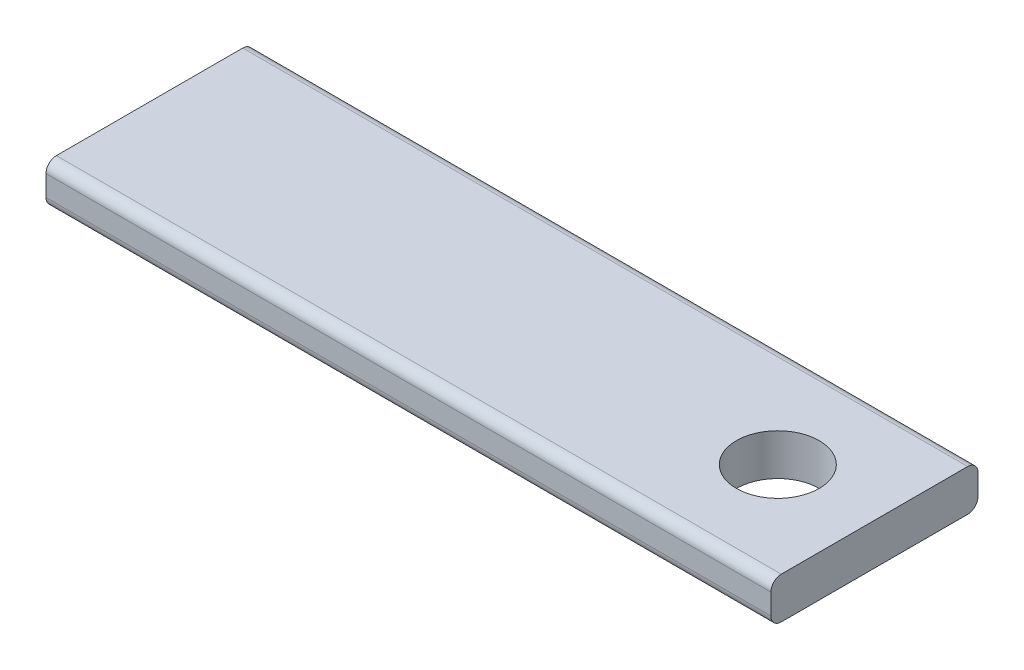
ISO-10303-21;
HEADER;
FILE_DESCRIPTION(('STEP AP214'),'2;1');
FILE_NAME('part.step','',(''),(''),'','','');
FILE_SCHEMA(('AUTOMOTIVE_DESIGN { 1 0 10303 214 1 1 1 1 }'));
ENDSEC;
DATA;
#1=APPLICATION_CONTEXT('core data for automotive mechanical design processes');
#2=APPLICATION_PROTOCOL_DEFINITION('international standard','automotive_design',2000,#1);
#3=PRODUCT_CONTEXT('',#1,'mechanical');
#4=PRODUCT('Part','Part','',(#3));
#5=PRODUCT_RELATED_PRODUCT_CATEGORY('part','',(#4));
#6=PRODUCT_DEFINITION_FORMATION('','',#4);
#7=PRODUCT_DEFINITION_CONTEXT('part definition',#1,'design');
#8=PRODUCT_DEFINITION('design','',#6,#7);
#9=PRODUCT_DEFINITION_SHAPE('','',#8);
#10=(LENGTH_UNIT() NAMED_UNIT(*) SI_UNIT(.MILLI.,.METRE.));
#11=(NAMED_UNIT(*) PLANE_ANGLE_UNIT() SI_UNIT($,.RADIAN.));
#12=(NAMED_UNIT(*) SI_UNIT($,.STERADIAN.) SOLID_ANGLE_UNIT());
#13=UNCERTAINTY_MEASURE_WITH_UNIT(LENGTH_MEASURE(1.E-05),#10,'distance_accuracy_value','');
#14=(GEOMETRIC_REPRESENTATION_CONTEXT(3) GLOBAL_UNCERTAINTY_ASSIGNED_CONTEXT((#13)) GLOBAL_UNIT_ASSIGNED_CONTEXT((#10,
#11,#12)) REPRESENTATION_CONTEXT('',''));
#15=CARTESIAN_POINT('',(0.,0.,0.));
#16=DIRECTION('',(0.,0.,1.));
#17=DIRECTION('',(1.,0.,0.));
#18=AXIS2_PLACEMENT_3D('',#15,#16,#17);
#19=CARTESIAN_POINT('',(26.25,1.5,7.5));
#20=DIRECTION('',(-1.,0.,0.));
#21=DIRECTION('',(0.,0.,1.));
#22=AXIS2_PLACEMENT_3D('',#19,#20,#21);
#23=PLANE('',#22);
#24=DIRECTION('',(0.,0.,-1.));
#25=VECTOR('',#24,1.);
#26=CARTESIAN_POINT('',(26.25,-1.5,7.5));
#27=LINE('',#26,#25);
#28=CARTESIAN_POINT('',(26.25,-1.5,6.75));
#29=VERTEX_POINT('',#28);
#30=CARTESIAN_POINT('',(26.25,-1.5,-6.75));
#31=VERTEX_POINT('',#30);
#32=EDGE_CURVE('E173',#29,#31,#27,.T.);
#33=ORIENTED_EDGE('',*,*,#32,.T.);
#34=CARTESIAN_POINT('',(26.25,-0.75,-6.75));
#35=DIRECTION('',(-1.,0.,0.));
#36=DIRECTION('',(0.,0.,1.));
#37=AXIS2_PLACEMENT_3D('',#34,#35,#36);
#38=CIRCLE('',#37,0.75);
#39=CARTESIAN_POINT('',(26.25,-0.75,-7.5));
#40=VERTEX_POINT('',#39);
#41=EDGE_CURVE('E147',#31,#40,#38,.F.);
#42=ORIENTED_EDGE('',*,*,#41,.T.);
#43=DIRECTION('',(0.,-1.,0.));
#44=VECTOR('',#43,1.);
#45=CARTESIAN_POINT('',(26.25,1.5,-7.5));
#46=LINE('',#45,#44);
#47=CARTESIAN_POINT('',(26.25,0.75,-7.5));
#48=VERTEX_POINT('',#47);
#49=EDGE_CURVE('E126',#48,#40,#46,.T.);
#50=ORIENTED_EDGE('',*,*,#49,.F.);
#51=CARTESIAN_POINT('',(26.25,0.75,-6.75));
#52=DIRECTION('',(-1.,0.,0.));
#53=DIRECTION('',(0.,0.,1.));
#54=AXIS2_PLACEMENT_3D('',#51,#52,#53);
#55=CIRCLE('',#54,0.75);
#56=CARTESIAN_POINT('',(26.25,1.5,-6.75));
#57=VERTEX_POINT('',#56);
#58=EDGE_CURVE('E131',#48,#57,#55,.F.);
#59=ORIENTED_EDGE('',*,*,#58,.T.);
#60=DIRECTION('',(0.,0.,-1.));
#61=VECTOR('',#60,1.);
#62=CARTESIAN_POINT('',(26.25,1.5,7.5));
#63=LINE('',#62,#61);
#64=CARTESIAN_POINT('',(26.25,1.5,6.75));
#65=VERTEX_POINT('',#64);
#66=EDGE_CURVE('E168',#65,#57,#63,.T.);
#67=ORIENTED_EDGE('',*,*,#66,.F.);
#68=CARTESIAN_POINT('',(26.25,0.75,6.75));
#69=DIRECTION('',(-1.,0.,0.));
#70=DIRECTION('',(0.,0.,1.));
#71=AXIS2_PLACEMENT_3D('',#68,#69,#70);
#72=CIRCLE('',#71,0.75);
#73=CARTESIAN_POINT('',(26.25,0.75,7.5));
#74=VERTEX_POINT('',#73);
#75=EDGE_CURVE('E61',#65,#74,#72,.F.);
#76=ORIENTED_EDGE('',*,*,#75,.T.);
#77=DIRECTION('',(0.,-1.,0.));
#78=VECTOR('',#77,1.);
#79=CARTESIAN_POINT('',(26.25,1.5,7.5));
#80=LINE('',#79,#78);
#81=CARTESIAN_POINT('',(26.25,-0.75,7.5));
#82=VERTEX_POINT('',#81);
#83=EDGE_CURVE('E158',#74,#82,#80,.T.);
#84=ORIENTED_EDGE('',*,*,#83,.T.);
#85=CARTESIAN_POINT('',(26.25,-0.75,6.75));
#86=DIRECTION('',(-1.,0.,0.));
#87=DIRECTION('',(0.,0.,1.));
#88=AXIS2_PLACEMENT_3D('',#85,#86,#87);
#89=CIRCLE('',#88,0.75);
#90=EDGE_CURVE('E54',#82,#29,#89,.F.);
#91=ORIENTED_EDGE('',*,*,#90,.T.);
#92=EDGE_LOOP('',(#33,#42,#50,#59,#67,#76,#84,#91));
#93=FACE_BOUND('',#92,.T.);
#94=ADVANCED_FACE('F39',(#93),#23,.F.);
#95=CARTESIAN_POINT('',(-26.25,1.5,-7.5));
#96=DIRECTION('',(0.,0.,1.));
#97=DIRECTION('',(1.,0.,0.));
#98=AXIS2_PLACEMENT_3D('',#95,#96,#97);
#99=PLANE('',#98);
#100=ORIENTED_EDGE('',*,*,#49,.T.);
#101=DIRECTION('',(-1.,0.,0.));
#102=VECTOR('',#101,1.);
#103=CARTESIAN_POINT('',(-26.25,-0.75,-7.5));
#104=LINE('',#103,#102);
#105=CARTESIAN_POINT('',(-26.25,-0.75,-7.5));
#106=VERTEX_POINT('',#105);
#107=EDGE_CURVE('E125',#40,#106,#104,.T.);
#108=ORIENTED_EDGE('',*,*,#107,.T.);
#109=DIRECTION('',(0.,-1.,0.));
#110=VECTOR('',#109,1.);
#111=CARTESIAN_POINT('',(-26.25,1.5,-7.5));
#112=LINE('',#111,#110);
#113=CARTESIAN_POINT('',(-26.25,0.75,-7.5));
#114=VERTEX_POINT('',#113);
#115=EDGE_CURVE('E108',#114,#106,#112,.T.);
#116=ORIENTED_EDGE('',*,*,#115,.F.);
#117=DIRECTION('',(-1.,0.,0.));
#118=VECTOR('',#117,1.);
#119=CARTESIAN_POINT('',(-26.25,0.75,-7.5));
#120=LINE('',#119,#118);
#121=EDGE_CURVE('E122',#114,#48,#120,.F.);
#122=ORIENTED_EDGE('',*,*,#121,.T.);
#123=EDGE_LOOP('',(#100,#108,#116,#122));
#124=FACE_BOUND('',#123,.T.);
#125=ADVANCED_FACE('F121',(#124),#99,.F.);
#126=CARTESIAN_POINT('',(-26.25,1.5,7.5));
#127=DIRECTION('',(1.,0.,0.));
#128=DIRECTION('',(0.,0.,-1.));
#129=AXIS2_PLACEMENT_3D('',#126,#127,#128);
#130=PLANE('',#129);
#131=ORIENTED_EDGE('',*,*,#115,.T.);
#132=CARTESIAN_POINT('',(-26.25,-0.75,-6.75));
#133=DIRECTION('',(1.,0.,0.));
#134=DIRECTION('',(0.,0.,-1.));
#135=AXIS2_PLACEMENT_3D('',#132,#133,#134);
#136=CIRCLE('',#135,0.75);
#137=CARTESIAN_POINT('',(-26.25,-1.5,-6.75));
#138=VERTEX_POINT('',#137);
#139=EDGE_CURVE('E115',#106,#138,#136,.F.);
#140=ORIENTED_EDGE('',*,*,#139,.T.);
#141=DIRECTION('',(0.,0.,1.));
#142=VECTOR('',#141,1.);
#143=CARTESIAN_POINT('',(-26.25,-1.5,7.5));
#144=LINE('',#143,#142);
#145=CARTESIAN_POINT('',(-26.25,-1.5,6.75));
#146=VERTEX_POINT('',#145);
#147=EDGE_CURVE('E170',#138,#146,#144,.T.);
#148=ORIENTED_EDGE('',*,*,#147,.T.);
#149=CARTESIAN_POINT('',(-26.25,-0.75,6.75));
#150=DIRECTION('',(1.,0.,0.));
#151=DIRECTION('',(0.,0.,-1.));
#152=AXIS2_PLACEMENT_3D('',#149,#150,#151);
#153=CIRCLE('',#152,0.75);
#154=CARTESIAN_POINT('',(-26.25,-0.75,7.5));
#155=VERTEX_POINT('',#154);
#156=EDGE_CURVE('E116',#146,#155,#153,.F.);
#157=ORIENTED_EDGE('',*,*,#156,.T.);
#158=DIRECTION('',(0.,-1.,0.));
#159=VECTOR('',#158,1.);
#160=CARTESIAN_POINT('',(-26.25,1.5,7.5));
#161=LINE('',#160,#159);
#162=CARTESIAN_POINT('',(-26.25,0.75,7.5));
#163=VERTEX_POINT('',#162);
#164=EDGE_CURVE('E127',#163,#155,#161,.T.);
#165=ORIENTED_EDGE('',*,*,#164,.F.);
#166=CARTESIAN_POINT('',(-26.25,0.75,6.75));
#167=DIRECTION('',(1.,0.,0.));
#168=DIRECTION('',(0.,0.,-1.));
#169=AXIS2_PLACEMENT_3D('',#166,#167,#168);
#170=CIRCLE('',#169,0.75);
#171=CARTESIAN_POINT('',(-26.25,1.5,6.75));
#172=VERTEX_POINT('',#171);
#173=EDGE_CURVE('E133',#163,#172,#170,.F.);
#174=ORIENTED_EDGE('',*,*,#173,.T.);
#175=DIRECTION('',(0.,0.,1.));
#176=VECTOR('',#175,1.);
#177=CARTESIAN_POINT('',(-26.25,1.5,7.5));
#178=LINE('',#177,#176);
#179=CARTESIAN_POINT('',(-26.25,1.5,-6.75));
#180=VERTEX_POINT('',#179);
#181=EDGE_CURVE('E110',#180,#172,#178,.T.);
#182=ORIENTED_EDGE('',*,*,#181,.F.);
#183=CARTESIAN_POINT('',(-26.25,0.75,-6.75));
#184=DIRECTION('',(1.,0.,0.));
#185=DIRECTION('',(0.,0.,-1.));
#186=AXIS2_PLACEMENT_3D('',#183,#184,#185);
#187=CIRCLE('',#186,0.75);
#188=EDGE_CURVE('E105',#180,#114,#187,.F.);
#189=ORIENTED_EDGE('',*,*,#188,.T.);
#190=EDGE_LOOP('',(#131,#140,#148,#157,#165,#174,#182,#189));
#191=FACE_BOUND('',#190,.T.);
#192=ADVANCED_FACE('F107',(#191),#130,.F.);
#193=CARTESIAN_POINT('',(-26.25,1.5,7.5));
#194=DIRECTION('',(0.,0.,-1.));
#195=DIRECTION('',(-1.,0.,0.));
#196=AXIS2_PLACEMENT_3D('',#193,#194,#195);
#197=PLANE('',#196);
#198=ORIENTED_EDGE('',*,*,#164,.T.);
#199=DIRECTION('',(1.,0.,0.));
#200=VECTOR('',#199,1.);
#201=CARTESIAN_POINT('',(26.25,-0.75,7.5));
#202=LINE('',#201,#200);
#203=EDGE_CURVE('E11',#155,#82,#202,.T.);
#204=ORIENTED_EDGE('',*,*,#203,.T.);
#205=ORIENTED_EDGE('',*,*,#83,.F.);
#206=DIRECTION('',(1.,0.,0.));
#207=VECTOR('',#206,1.);
#208=CARTESIAN_POINT('',(-26.25,0.75,7.5));
#209=LINE('',#208,#207);
#210=EDGE_CURVE('E47',#74,#163,#209,.F.);
#211=ORIENTED_EDGE('',*,*,#210,.T.);
#212=EDGE_LOOP('',(#198,#204,#205,#211));
#213=FACE_BOUND('',#212,.T.);
#214=ADVANCED_FACE('F157',(#213),#197,.F.);
#215=CARTESIAN_POINT('',(0.,1.5,0.));
#216=DIRECTION('',(0.,-1.,0.));
#217=DIRECTION('',(0.,0.,-1.));
#218=AXIS2_PLACEMENT_3D('',#215,#216,#217);
#219=PLANE('',#218);
#220=CARTESIAN_POINT('',(19.25,1.5,0.));
#221=DIRECTION('',(0.,1.,0.));
#222=DIRECTION('',(0.,0.,1.));
#223=AXIS2_PLACEMENT_3D('',#220,#221,#222);
#224=CIRCLE('',#223,3.);
#225=CARTESIAN_POINT('',(19.25,1.5,3.));
#226=VERTEX_POINT('',#225);
#227=EDGE_CURVE('E176',#226,#226,#224,.T.);
#228=ORIENTED_EDGE('',*,*,#227,.F.);
#229=EDGE_LOOP('',(#228));
#230=FACE_BOUND('',#229,.T.);
#231=ORIENTED_EDGE('',*,*,#66,.T.);
#232=DIRECTION('',(-1.,0.,0.));
#233=VECTOR('',#232,1.);
#234=CARTESIAN_POINT('',(0.,1.5,-6.75));
#235=LINE('',#234,#233);
#236=EDGE_CURVE('E152',#57,#180,#235,.T.);
#237=ORIENTED_EDGE('',*,*,#236,.T.);
#238=ORIENTED_EDGE('',*,*,#181,.T.);
#239=DIRECTION('',(1.,0.,0.));
#240=VECTOR('',#239,1.);
#241=CARTESIAN_POINT('',(0.,1.5,6.75));
#242=LINE('',#241,#240);
#243=EDGE_CURVE('E149',#172,#65,#242,.T.);
#244=ORIENTED_EDGE('',*,*,#243,.T.);
#245=EDGE_LOOP('',(#231,#237,#238,#244));
#246=FACE_BOUND('',#245,.T.);
#247=ADVANCED_FACE('F167',(#230,#246),#219,.F.);
#248=CARTESIAN_POINT('',(0.,-1.5,0.));
#249=DIRECTION('',(0.,-1.,0.));
#250=DIRECTION('',(0.,0.,-1.));
#251=AXIS2_PLACEMENT_3D('',#248,#249,#250);
#252=PLANE('',#251);
#253=CARTESIAN_POINT('',(19.25,-1.5,0.));
#254=DIRECTION('',(0.,1.,0.));
#255=DIRECTION('',(0.,0.,1.));
#256=AXIS2_PLACEMENT_3D('',#253,#254,#255);
#257=CIRCLE('',#256,3.);
#258=CARTESIAN_POINT('',(19.25,-1.5,3.));
#259=VERTEX_POINT('',#258);
#260=EDGE_CURVE('E179',#259,#259,#257,.T.);
#261=ORIENTED_EDGE('',*,*,#260,.T.);
#262=EDGE_LOOP('',(#261));
#263=FACE_BOUND('',#262,.T.);
#264=ORIENTED_EDGE('',*,*,#147,.F.);
#265=DIRECTION('',(-1.,0.,0.));
#266=VECTOR('',#265,1.);
#267=CARTESIAN_POINT('',(26.25,-1.5,-6.75));
#268=LINE('',#267,#266);
#269=EDGE_CURVE('E142',#138,#31,#268,.F.);
#270=ORIENTED_EDGE('',*,*,#269,.T.);
#271=ORIENTED_EDGE('',*,*,#32,.F.);
#272=DIRECTION('',(1.,0.,0.));
#273=VECTOR('',#272,1.);
#274=CARTESIAN_POINT('',(-26.25,-1.5,6.75));
#275=LINE('',#274,#273);
#276=EDGE_CURVE('E140',#29,#146,#275,.F.);
#277=ORIENTED_EDGE('',*,*,#276,.T.);
#278=EDGE_LOOP('',(#264,#270,#271,#277));
#279=FACE_BOUND('',#278,.T.);
#280=ADVANCED_FACE('F185',(#263,#279),#252,.T.);
#281=CARTESIAN_POINT('',(-26.25,-0.75,-6.75));
#282=DIRECTION('',(1.,0.,0.));
#283=DIRECTION('',(0.,0.,-1.));
#284=AXIS2_PLACEMENT_3D('',#281,#282,#283);
#285=CYLINDRICAL_SURFACE('',#284,0.75);
#286=ORIENTED_EDGE('',*,*,#41,.F.);
#287=ORIENTED_EDGE('',*,*,#269,.F.);
#288=ORIENTED_EDGE('',*,*,#139,.F.);
#289=ORIENTED_EDGE('',*,*,#107,.F.);
#290=EDGE_LOOP('',(#286,#287,#288,#289));
#291=FACE_BOUND('',#290,.T.);
#292=ADVANCED_FACE('F194',(#291),#285,.T.);
#293=CARTESIAN_POINT('',(0.,0.75,-6.75));
#294=DIRECTION('',(-1.,0.,0.));
#295=DIRECTION('',(0.,0.,1.));
#296=AXIS2_PLACEMENT_3D('',#293,#294,#295);
#297=CYLINDRICAL_SURFACE('',#296,0.75);
#298=ORIENTED_EDGE('',*,*,#58,.F.);
#299=ORIENTED_EDGE('',*,*,#121,.F.);
#300=ORIENTED_EDGE('',*,*,#188,.F.);
#301=ORIENTED_EDGE('',*,*,#236,.F.);
#302=EDGE_LOOP('',(#298,#299,#300,#301));
#303=FACE_BOUND('',#302,.T.);
#304=ADVANCED_FACE('F130',(#303),#297,.T.);
#305=CARTESIAN_POINT('',(-26.25,-0.75,6.75));
#306=DIRECTION('',(-1.,0.,0.));
#307=DIRECTION('',(0.,0.,1.));
#308=AXIS2_PLACEMENT_3D('',#305,#306,#307);
#309=CYLINDRICAL_SURFACE('',#308,0.75);
#310=ORIENTED_EDGE('',*,*,#156,.F.);
#311=ORIENTED_EDGE('',*,*,#276,.F.);
#312=ORIENTED_EDGE('',*,*,#90,.F.);
#313=ORIENTED_EDGE('',*,*,#203,.F.);
#314=EDGE_LOOP('',(#310,#311,#312,#313));
#315=FACE_BOUND('',#314,.T.);
#316=ADVANCED_FACE('F187',(#315),#309,.T.);
#317=CARTESIAN_POINT('',(0.,0.75,6.75));
#318=DIRECTION('',(1.,0.,0.));
#319=DIRECTION('',(0.,0.,-1.));
#320=AXIS2_PLACEMENT_3D('',#317,#318,#319);
#321=CYLINDRICAL_SURFACE('',#320,0.75);
#322=ORIENTED_EDGE('',*,*,#173,.F.);
#323=ORIENTED_EDGE('',*,*,#210,.F.);
#324=ORIENTED_EDGE('',*,*,#75,.F.);
#325=ORIENTED_EDGE('',*,*,#243,.F.);
#326=EDGE_LOOP('',(#322,#323,#324,#325));
#327=FACE_BOUND('',#326,.T.);
#328=ADVANCED_FACE('F41',(#327),#321,.T.);
#329=CARTESIAN_POINT('',(19.25,-1.5,0.));
#330=DIRECTION('',(0.,1.,0.));
#331=DIRECTION('',(0.,0.,1.));
#332=AXIS2_PLACEMENT_3D('',#329,#330,#331);
#333=CYLINDRICAL_SURFACE('',#332,3.);
#334=ORIENTED_EDGE('',*,*,#260,.F.);
#335=EDGE_LOOP('',(#334));
#336=FACE_BOUND('',#335,.T.);
#337=ORIENTED_EDGE('',*,*,#227,.T.);
#338=EDGE_LOOP('',(#337));
#339=FACE_BOUND('',#338,.T.);
#340=ADVANCED_FACE('F193',(#336,#339),#333,.F.);
#341=CLOSED_SHELL('',(#94,#125,#192,#214,#247,#280,#292,#304,#316,#328,#340));
#342=MANIFOLD_SOLID_BREP('B2',#341);
#343=ADVANCED_BREP_SHAPE_REPRESENTATION('',(#18,#342),#14);
#344=SHAPE_DEFINITION_REPRESENTATION(#9,#343);
ENDSEC;
END-ISO-10303-21;
